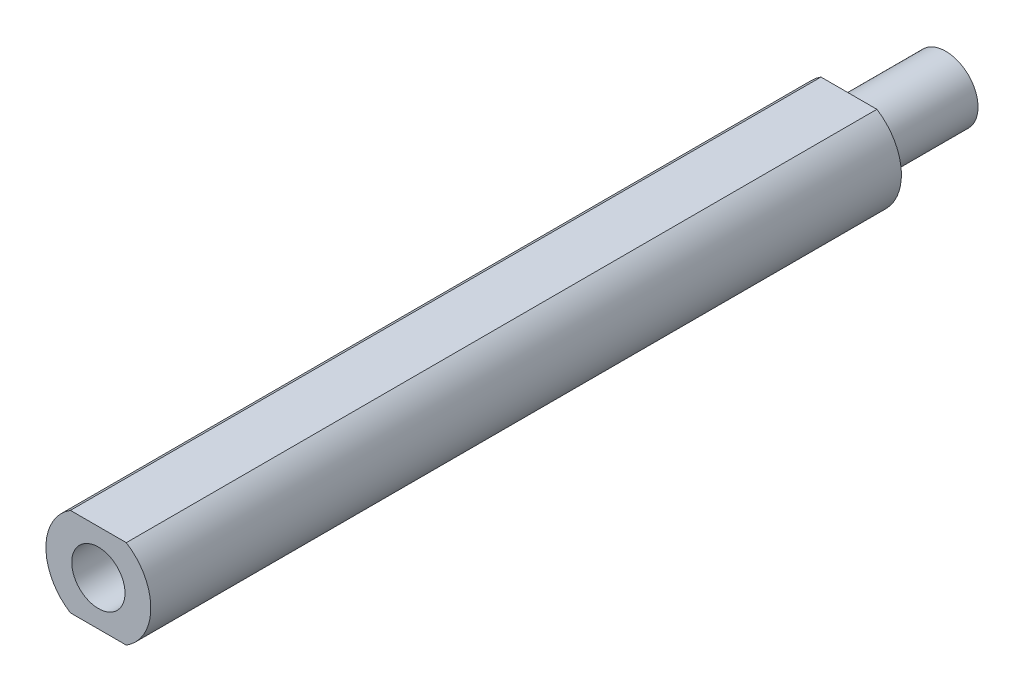
ISO-10303-21;
HEADER;
FILE_DESCRIPTION(('STEP AP214'),'2;1');
FILE_NAME('part.step','',(''),(''),'','','');
FILE_SCHEMA(('AUTOMOTIVE_DESIGN { 1 0 10303 214 1 1 1 1 }'));
ENDSEC;
DATA;
#1=APPLICATION_CONTEXT('core data for automotive mechanical design processes');
#2=APPLICATION_PROTOCOL_DEFINITION('international standard','automotive_design',2000,#1);
#3=PRODUCT_CONTEXT('',#1,'mechanical');
#4=PRODUCT('Part','Part','',(#3));
#5=PRODUCT_RELATED_PRODUCT_CATEGORY('part','',(#4));
#6=PRODUCT_DEFINITION_FORMATION('','',#4);
#7=PRODUCT_DEFINITION_CONTEXT('part definition',#1,'design');
#8=PRODUCT_DEFINITION('design','',#6,#7);
#9=PRODUCT_DEFINITION_SHAPE('','',#8);
#10=(LENGTH_UNIT() NAMED_UNIT(*) SI_UNIT(.MILLI.,.METRE.));
#11=(NAMED_UNIT(*) PLANE_ANGLE_UNIT() SI_UNIT($,.RADIAN.));
#12=(NAMED_UNIT(*) SI_UNIT($,.STERADIAN.) SOLID_ANGLE_UNIT());
#13=UNCERTAINTY_MEASURE_WITH_UNIT(LENGTH_MEASURE(1.E-05),#10,'distance_accuracy_value','');
#14=(GEOMETRIC_REPRESENTATION_CONTEXT(3) GLOBAL_UNCERTAINTY_ASSIGNED_CONTEXT((#13)) GLOBAL_UNIT_ASSIGNED_CONTEXT((#10,
#11,#12)) REPRESENTATION_CONTEXT('',''));
#15=CARTESIAN_POINT('',(0.,0.,0.));
#16=DIRECTION('',(0.,0.,1.));
#17=DIRECTION('',(1.,0.,0.));
#18=AXIS2_PLACEMENT_3D('',#15,#16,#17);
#19=CARTESIAN_POINT('',(0.,0.,46.5));
#20=DIRECTION('',(0.,0.,-1.));
#21=DIRECTION('',(-1.,0.,0.));
#22=AXIS2_PLACEMENT_3D('',#19,#20,#21);
#23=CYLINDRICAL_SURFACE('',#22,3.25);
#24=CARTESIAN_POINT('',(0.,0.,0.));
#25=DIRECTION('',(0.,0.,1.));
#26=DIRECTION('',(1.,0.,0.));
#27=AXIS2_PLACEMENT_3D('',#24,#25,#26);
#28=CIRCLE('',#27,3.25);
#29=CARTESIAN_POINT('',(-1.73205080756888,2.75,0.));
#30=VERTEX_POINT('',#29);
#31=CARTESIAN_POINT('',(-1.73205080756888,-2.75,0.));
#32=VERTEX_POINT('',#31);
#33=EDGE_CURVE('E104',#30,#32,#28,.T.);
#34=ORIENTED_EDGE('',*,*,#33,.T.);
#35=DIRECTION('',(0.,0.,-1.));
#36=VECTOR('',#35,1.);
#37=CARTESIAN_POINT('',(-1.73205080756888,-2.75,46.5));
#38=LINE('',#37,#36);
#39=CARTESIAN_POINT('',(-1.73205080756888,-2.75,46.5));
#40=VERTEX_POINT('',#39);
#41=EDGE_CURVE('E44',#40,#32,#38,.T.);
#42=ORIENTED_EDGE('',*,*,#41,.F.);
#43=CARTESIAN_POINT('',(0.,0.,46.5));
#44=DIRECTION('',(0.,0.,1.));
#45=DIRECTION('',(1.,0.,0.));
#46=AXIS2_PLACEMENT_3D('',#43,#44,#45);
#47=CIRCLE('',#46,3.25);
#48=CARTESIAN_POINT('',(-1.73205080756888,2.75,46.5));
#49=VERTEX_POINT('',#48);
#50=EDGE_CURVE('E114',#49,#40,#47,.T.);
#51=ORIENTED_EDGE('',*,*,#50,.F.);
#52=DIRECTION('',(0.,0.,-1.));
#53=VECTOR('',#52,1.);
#54=CARTESIAN_POINT('',(-1.73205080756888,2.75,46.5));
#55=LINE('',#54,#53);
#56=EDGE_CURVE('E119',#49,#30,#55,.T.);
#57=ORIENTED_EDGE('',*,*,#56,.T.);
#58=EDGE_LOOP('',(#34,#42,#51,#57));
#59=FACE_BOUND('',#58,.T.);
#60=ADVANCED_FACE('F41',(#59),#23,.T.);
#61=CARTESIAN_POINT('',(-1.73205080756888,-2.75,46.5));
#62=DIRECTION('',(0.,1.,0.));
#63=DIRECTION('',(0.,0.,1.));
#64=AXIS2_PLACEMENT_3D('',#61,#62,#63);
#65=PLANE('',#64);
#66=DIRECTION('',(1.,0.,0.));
#67=VECTOR('',#66,1.);
#68=CARTESIAN_POINT('',(-1.73205080756888,-2.75,0.));
#69=LINE('',#68,#67);
#70=CARTESIAN_POINT('',(1.73205080756888,-2.75,0.));
#71=VERTEX_POINT('',#70);
#72=EDGE_CURVE('E108',#32,#71,#69,.T.);
#73=ORIENTED_EDGE('',*,*,#72,.T.);
#74=DIRECTION('',(0.,0.,-1.));
#75=VECTOR('',#74,1.);
#76=CARTESIAN_POINT('',(1.73205080756888,-2.75,46.5));
#77=LINE('',#76,#75);
#78=CARTESIAN_POINT('',(1.73205080756888,-2.75,46.5));
#79=VERTEX_POINT('',#78);
#80=EDGE_CURVE('E126',#79,#71,#77,.T.);
#81=ORIENTED_EDGE('',*,*,#80,.F.);
#82=DIRECTION('',(1.,0.,0.));
#83=VECTOR('',#82,1.);
#84=CARTESIAN_POINT('',(-1.73205080756888,-2.75,46.5));
#85=LINE('',#84,#83);
#86=EDGE_CURVE('E90',#40,#79,#85,.T.);
#87=ORIENTED_EDGE('',*,*,#86,.F.);
#88=ORIENTED_EDGE('',*,*,#41,.T.);
#89=EDGE_LOOP('',(#73,#81,#87,#88));
#90=FACE_BOUND('',#89,.T.);
#91=ADVANCED_FACE('F129',(#90),#65,.F.);
#92=CARTESIAN_POINT('',(0.,0.,46.5));
#93=DIRECTION('',(0.,0.,-1.));
#94=DIRECTION('',(-1.,0.,0.));
#95=AXIS2_PLACEMENT_3D('',#92,#93,#94);
#96=CYLINDRICAL_SURFACE('',#95,3.25);
#97=CARTESIAN_POINT('',(0.,0.,0.));
#98=DIRECTION('',(0.,0.,1.));
#99=DIRECTION('',(1.,0.,0.));
#100=AXIS2_PLACEMENT_3D('',#97,#98,#99);
#101=CIRCLE('',#100,3.25);
#102=CARTESIAN_POINT('',(1.73205080756888,2.75,0.));
#103=VERTEX_POINT('',#102);
#104=EDGE_CURVE('E76',#71,#103,#101,.T.);
#105=ORIENTED_EDGE('',*,*,#104,.T.);
#106=DIRECTION('',(0.,0.,-1.));
#107=VECTOR('',#106,1.);
#108=CARTESIAN_POINT('',(1.73205080756888,2.75,46.5));
#109=LINE('',#108,#107);
#110=CARTESIAN_POINT('',(1.73205080756888,2.75,46.5));
#111=VERTEX_POINT('',#110);
#112=EDGE_CURVE('E125',#111,#103,#109,.T.);
#113=ORIENTED_EDGE('',*,*,#112,.F.);
#114=CARTESIAN_POINT('',(0.,0.,46.5));
#115=DIRECTION('',(0.,0.,1.));
#116=DIRECTION('',(1.,0.,0.));
#117=AXIS2_PLACEMENT_3D('',#114,#115,#116);
#118=CIRCLE('',#117,3.25);
#119=EDGE_CURVE('E117',#79,#111,#118,.T.);
#120=ORIENTED_EDGE('',*,*,#119,.F.);
#121=ORIENTED_EDGE('',*,*,#80,.T.);
#122=EDGE_LOOP('',(#105,#113,#120,#121));
#123=FACE_BOUND('',#122,.T.);
#124=ADVANCED_FACE('F150',(#123),#96,.T.);
#125=CARTESIAN_POINT('',(-1.73205080756888,2.75,46.5));
#126=DIRECTION('',(0.,-1.,0.));
#127=DIRECTION('',(0.,0.,-1.));
#128=AXIS2_PLACEMENT_3D('',#125,#126,#127);
#129=PLANE('',#128);
#130=DIRECTION('',(-1.,0.,0.));
#131=VECTOR('',#130,1.);
#132=CARTESIAN_POINT('',(-1.73205080756888,2.75,0.));
#133=LINE('',#132,#131);
#134=EDGE_CURVE('E82',#103,#30,#133,.T.);
#135=ORIENTED_EDGE('',*,*,#134,.T.);
#136=ORIENTED_EDGE('',*,*,#56,.F.);
#137=DIRECTION('',(-1.,0.,0.));
#138=VECTOR('',#137,1.);
#139=CARTESIAN_POINT('',(-1.73205080756888,2.75,46.5));
#140=LINE('',#139,#138);
#141=EDGE_CURVE('E58',#111,#49,#140,.T.);
#142=ORIENTED_EDGE('',*,*,#141,.F.);
#143=ORIENTED_EDGE('',*,*,#112,.T.);
#144=EDGE_LOOP('',(#135,#136,#142,#143));
#145=FACE_BOUND('',#144,.T.);
#146=ADVANCED_FACE('F141',(#145),#129,.F.);
#147=CARTESIAN_POINT('',(0.,0.,46.5));
#148=DIRECTION('',(0.,0.,1.));
#149=DIRECTION('',(1.,0.,0.));
#150=AXIS2_PLACEMENT_3D('',#147,#148,#149);
#151=PLANE('',#150);
#152=CARTESIAN_POINT('',(0.,0.,46.5));
#153=DIRECTION('',(0.,0.,1.));
#154=DIRECTION('',(1.,0.,0.));
#155=AXIS2_PLACEMENT_3D('',#152,#153,#154);
#156=CIRCLE('',#155,1.64999999999999);
#157=CARTESIAN_POINT('',(1.64999999999999,0.,46.5));
#158=VERTEX_POINT('',#157);
#159=EDGE_CURVE('E105',#158,#158,#156,.T.);
#160=ORIENTED_EDGE('',*,*,#159,.F.);
#161=EDGE_LOOP('',(#160));
#162=FACE_BOUND('',#161,.T.);
#163=ORIENTED_EDGE('',*,*,#50,.T.);
#164=ORIENTED_EDGE('',*,*,#86,.T.);
#165=ORIENTED_EDGE('',*,*,#119,.T.);
#166=ORIENTED_EDGE('',*,*,#141,.T.);
#167=EDGE_LOOP('',(#163,#164,#165,#166));
#168=FACE_BOUND('',#167,.T.);
#169=ADVANCED_FACE('F135',(#162,#168),#151,.T.);
#170=CARTESIAN_POINT('',(0.,0.,0.));
#171=DIRECTION('',(0.,0.,1.));
#172=DIRECTION('',(1.,0.,0.));
#173=AXIS2_PLACEMENT_3D('',#170,#171,#172);
#174=PLANE('',#173);
#175=CARTESIAN_POINT('',(0.,0.,0.));
#176=DIRECTION('',(0.,0.,-1.));
#177=DIRECTION('',(-1.,0.,0.));
#178=AXIS2_PLACEMENT_3D('',#175,#176,#177);
#179=CIRCLE('',#178,2.);
#180=CARTESIAN_POINT('',(-2.,0.,0.));
#181=VERTEX_POINT('',#180);
#182=EDGE_CURVE('E11',#181,#181,#179,.T.);
#183=ORIENTED_EDGE('',*,*,#182,.F.);
#184=EDGE_LOOP('',(#183));
#185=FACE_BOUND('',#184,.T.);
#186=ORIENTED_EDGE('',*,*,#33,.F.);
#187=ORIENTED_EDGE('',*,*,#134,.F.);
#188=ORIENTED_EDGE('',*,*,#104,.F.);
#189=ORIENTED_EDGE('',*,*,#72,.F.);
#190=EDGE_LOOP('',(#186,#187,#188,#189));
#191=FACE_BOUND('',#190,.T.);
#192=ADVANCED_FACE('F98',(#185,#191),#174,.F.);
#193=CARTESIAN_POINT('',(0.,0.,34.5));
#194=DIRECTION('',(0.,0.,1.));
#195=DIRECTION('',(1.,0.,0.));
#196=AXIS2_PLACEMENT_3D('',#193,#194,#195);
#197=CONICAL_SURFACE('',#196,1.65,1.02974425867665);
#198=CARTESIAN_POINT('',(0.,0.,33.5085799786045));
#199=VERTEX_POINT('',#198);
#200=VERTEX_LOOP('',#199);
#201=FACE_BOUND('',#200,.T.);
#202=CARTESIAN_POINT('',(0.,0.,34.5));
#203=DIRECTION('',(0.,0.,1.));
#204=DIRECTION('',(1.,0.,0.));
#205=AXIS2_PLACEMENT_3D('',#202,#203,#204);
#206=CIRCLE('',#205,1.65);
#207=CARTESIAN_POINT('',(1.65,0.,34.5));
#208=VERTEX_POINT('',#207);
#209=EDGE_CURVE('E102',#208,#208,#206,.T.);
#210=ORIENTED_EDGE('',*,*,#209,.T.);
#211=EDGE_LOOP('',(#210));
#212=FACE_BOUND('',#211,.T.);
#213=ADVANCED_FACE('F94',(#201,#212),#197,.F.);
#214=CARTESIAN_POINT('',(0.,0.,46.5));
#215=DIRECTION('',(0.,0.,1.));
#216=DIRECTION('',(1.,0.,0.));
#217=AXIS2_PLACEMENT_3D('',#214,#215,#216);
#218=CYLINDRICAL_SURFACE('',#217,1.64999999999999);
#219=ORIENTED_EDGE('',*,*,#209,.F.);
#220=EDGE_LOOP('',(#219));
#221=FACE_BOUND('',#220,.T.);
#222=ORIENTED_EDGE('',*,*,#159,.T.);
#223=EDGE_LOOP('',(#222));
#224=FACE_BOUND('',#223,.T.);
#225=ADVANCED_FACE('F97',(#221,#224),#218,.F.);
#226=CARTESIAN_POINT('',(0.,0.,-6.));
#227=DIRECTION('',(0.,0.,1.));
#228=DIRECTION('',(1.,0.,0.));
#229=AXIS2_PLACEMENT_3D('',#226,#227,#228);
#230=CYLINDRICAL_SURFACE('',#229,2.);
#231=CARTESIAN_POINT('',(0.,0.,-6.));
#232=DIRECTION('',(0.,0.,-1.));
#233=DIRECTION('',(-1.,0.,0.));
#234=AXIS2_PLACEMENT_3D('',#231,#232,#233);
#235=CIRCLE('',#234,2.);
#236=CARTESIAN_POINT('',(-2.,0.,-6.));
#237=VERTEX_POINT('',#236);
#238=EDGE_CURVE('E111',#237,#237,#235,.T.);
#239=ORIENTED_EDGE('',*,*,#238,.F.);
#240=EDGE_LOOP('',(#239));
#241=FACE_BOUND('',#240,.T.);
#242=ORIENTED_EDGE('',*,*,#182,.T.);
#243=EDGE_LOOP('',(#242));
#244=FACE_BOUND('',#243,.T.);
#245=ADVANCED_FACE('F180',(#241,#244),#230,.T.);
#246=CARTESIAN_POINT('',(0.,0.,-6.));
#247=DIRECTION('',(0.,0.,-1.));
#248=DIRECTION('',(-1.,0.,0.));
#249=AXIS2_PLACEMENT_3D('',#246,#247,#248);
#250=PLANE('',#249);
#251=ORIENTED_EDGE('',*,*,#238,.T.);
#252=EDGE_LOOP('',(#251));
#253=FACE_BOUND('',#252,.T.);
#254=ADVANCED_FACE('F195',(#253),#250,.T.);
#255=CLOSED_SHELL('',(#60,#91,#124,#146,#169,#192,#213,#225,#245,#254));
#256=MANIFOLD_SOLID_BREP('B2',#255);
#257=ADVANCED_BREP_SHAPE_REPRESENTATION('',(#18,#256),#14);
#258=SHAPE_DEFINITION_REPRESENTATION(#9,#257);
ENDSEC;
END-ISO-10303-21;
